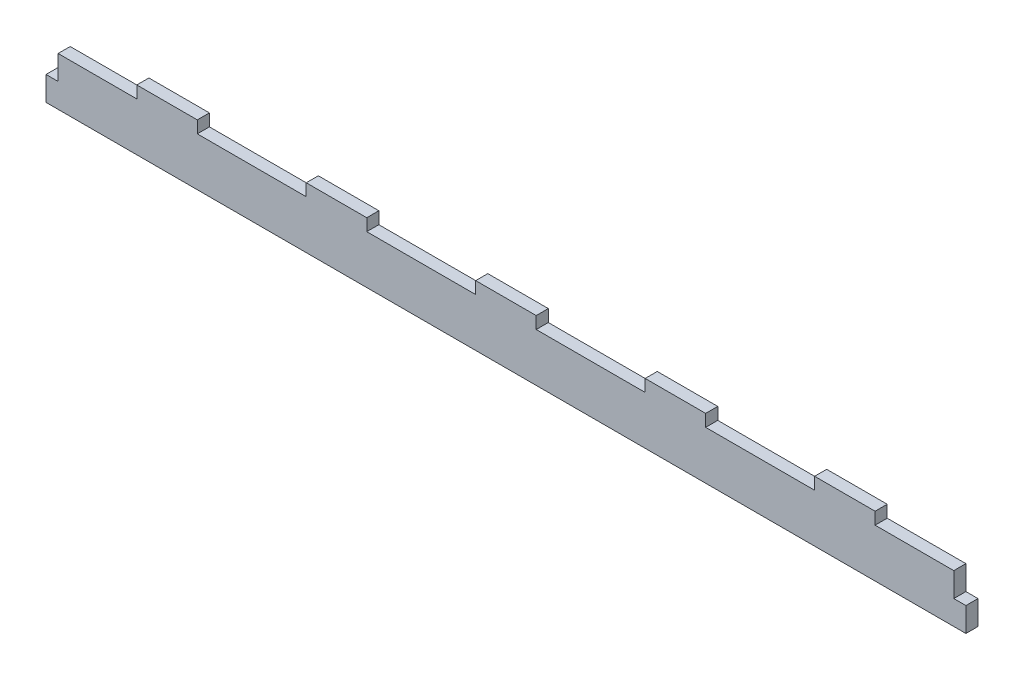
ISO-10303-21;
HEADER;
FILE_DESCRIPTION(('STEP AP214'),'2;1');
FILE_NAME('part.step','',(''),(''),'','','');
FILE_SCHEMA(('AUTOMOTIVE_DESIGN { 1 0 10303 214 1 1 1 1 }'));
ENDSEC;
DATA;
#1=APPLICATION_CONTEXT('core data for automotive mechanical design processes');
#2=APPLICATION_PROTOCOL_DEFINITION('international standard','automotive_design',2000,#1);
#3=PRODUCT_CONTEXT('',#1,'mechanical');
#4=PRODUCT('Part','Part','',(#3));
#5=PRODUCT_RELATED_PRODUCT_CATEGORY('part','',(#4));
#6=PRODUCT_DEFINITION_FORMATION('','',#4);
#7=PRODUCT_DEFINITION_CONTEXT('part definition',#1,'design');
#8=PRODUCT_DEFINITION('design','',#6,#7);
#9=PRODUCT_DEFINITION_SHAPE('','',#8);
#10=(LENGTH_UNIT() NAMED_UNIT(*) SI_UNIT(.MILLI.,.METRE.));
#11=(NAMED_UNIT(*) PLANE_ANGLE_UNIT() SI_UNIT($,.RADIAN.));
#12=(NAMED_UNIT(*) SI_UNIT($,.STERADIAN.) SOLID_ANGLE_UNIT());
#13=UNCERTAINTY_MEASURE_WITH_UNIT(LENGTH_MEASURE(1.E-05),#10,'distance_accuracy_value','');
#14=(GEOMETRIC_REPRESENTATION_CONTEXT(3) GLOBAL_UNCERTAINTY_ASSIGNED_CONTEXT((#13)) GLOBAL_UNIT_ASSIGNED_CONTEXT((#10,
#11,#12)) REPRESENTATION_CONTEXT('',''));
#15=CARTESIAN_POINT('',(0.,0.,0.));
#16=DIRECTION('',(0.,0.,1.));
#17=DIRECTION('',(1.,0.,0.));
#18=AXIS2_PLACEMENT_3D('',#15,#16,#17);
#19=CARTESIAN_POINT('',(72.5000000000003,0.,2.5));
#20=DIRECTION('',(-1.,0.,0.));
#21=DIRECTION('',(0.,0.,1.));
#22=AXIS2_PLACEMENT_3D('',#19,#20,#21);
#23=PLANE('',#22);
#24=DIRECTION('',(0.,1.,0.));
#25=VECTOR('',#24,1.);
#26=CARTESIAN_POINT('',(72.5000000000003,0.,-2.5));
#27=LINE('',#26,#25);
#28=CARTESIAN_POINT('',(72.5000000000003,-24.9999999999885,-2.5));
#29=VERTEX_POINT('',#28);
#30=CARTESIAN_POINT('',(72.5000000000003,-19.9999999999999,-2.5));
#31=VERTEX_POINT('',#30);
#32=EDGE_CURVE('E253',#29,#31,#27,.T.);
#33=ORIENTED_EDGE('',*,*,#32,.F.);
#34=DIRECTION('',(0.,0.,-1.));
#35=VECTOR('',#34,1.);
#36=CARTESIAN_POINT('',(72.5000000000003,-24.9999999999885,2.5));
#37=LINE('',#36,#35);
#38=CARTESIAN_POINT('',(72.5000000000003,-24.9999999999885,2.5));
#39=VERTEX_POINT('',#38);
#40=EDGE_CURVE('E11',#39,#29,#37,.T.);
#41=ORIENTED_EDGE('',*,*,#40,.F.);
#42=DIRECTION('',(0.,1.,0.));
#43=VECTOR('',#42,1.);
#44=CARTESIAN_POINT('',(72.5000000000003,0.,2.5));
#45=LINE('',#44,#43);
#46=CARTESIAN_POINT('',(72.5000000000003,-19.9999999999999,2.5));
#47=VERTEX_POINT('',#46);
#48=EDGE_CURVE('E327',#39,#47,#45,.T.);
#49=ORIENTED_EDGE('',*,*,#48,.T.);
#50=DIRECTION('',(0.,0.,-1.));
#51=VECTOR('',#50,1.);
#52=CARTESIAN_POINT('',(72.5000000000003,-19.9999999999999,2.5));
#53=LINE('',#52,#51);
#54=EDGE_CURVE('E55',#47,#31,#53,.T.);
#55=ORIENTED_EDGE('',*,*,#54,.T.);
#56=EDGE_LOOP('',(#33,#41,#49,#55));
#57=FACE_BOUND('',#56,.T.);
#58=ADVANCED_FACE('F39',(#57),#23,.T.);
#59=CARTESIAN_POINT('',(0.,-24.9999999999885,2.5));
#60=DIRECTION('',(0.,-1.,0.));
#61=DIRECTION('',(0.,0.,-1.));
#62=AXIS2_PLACEMENT_3D('',#59,#60,#61);
#63=PLANE('',#62);
#64=DIRECTION('',(-1.,0.,0.));
#65=VECTOR('',#64,1.);
#66=CARTESIAN_POINT('',(0.,-24.9999999999885,-2.5));
#67=LINE('',#66,#65);
#68=CARTESIAN_POINT('',(40.,-24.9999999999885,-2.5));
#69=VERTEX_POINT('',#68);
#70=EDGE_CURVE('E255',#29,#69,#67,.T.);
#71=ORIENTED_EDGE('',*,*,#70,.T.);
#72=DIRECTION('',(0.,0.,-1.));
#73=VECTOR('',#72,1.);
#74=CARTESIAN_POINT('',(40.,-24.9999999999885,2.5));
#75=LINE('',#74,#73);
#76=CARTESIAN_POINT('',(40.,-24.9999999999885,2.5));
#77=VERTEX_POINT('',#76);
#78=EDGE_CURVE('E47',#77,#69,#75,.T.);
#79=ORIENTED_EDGE('',*,*,#78,.F.);
#80=DIRECTION('',(-1.,0.,0.));
#81=VECTOR('',#80,1.);
#82=CARTESIAN_POINT('',(0.,-24.9999999999885,2.5));
#83=LINE('',#82,#81);
#84=EDGE_CURVE('E404',#39,#77,#83,.T.);
#85=ORIENTED_EDGE('',*,*,#84,.F.);
#86=ORIENTED_EDGE('',*,*,#40,.T.);
#87=EDGE_LOOP('',(#71,#79,#85,#86));
#88=FACE_BOUND('',#87,.T.);
#89=ADVANCED_FACE('F469',(#88),#63,.F.);
#90=CARTESIAN_POINT('',(40.,0.,2.5));
#91=DIRECTION('',(1.,0.,0.));
#92=DIRECTION('',(0.,0.,-1.));
#93=AXIS2_PLACEMENT_3D('',#90,#91,#92);
#94=PLANE('',#93);
#95=DIRECTION('',(0.,-1.,0.));
#96=VECTOR('',#95,1.);
#97=CARTESIAN_POINT('',(40.,0.,-2.5));
#98=LINE('',#97,#96);
#99=CARTESIAN_POINT('',(40.,-34.9999999999885,-2.5));
#100=VERTEX_POINT('',#99);
#101=EDGE_CURVE('E257',#69,#100,#98,.T.);
#102=ORIENTED_EDGE('',*,*,#101,.T.);
#103=DIRECTION('',(0.,0.,-1.));
#104=VECTOR('',#103,1.);
#105=CARTESIAN_POINT('',(40.,-34.9999999999885,2.5));
#106=LINE('',#105,#104);
#107=CARTESIAN_POINT('',(40.,-34.9999999999885,2.5));
#108=VERTEX_POINT('',#107);
#109=EDGE_CURVE('E377',#108,#100,#106,.T.);
#110=ORIENTED_EDGE('',*,*,#109,.F.);
#111=DIRECTION('',(0.,-1.,0.));
#112=VECTOR('',#111,1.);
#113=CARTESIAN_POINT('',(40.,0.,2.5));
#114=LINE('',#113,#112);
#115=EDGE_CURVE('E386',#77,#108,#114,.T.);
#116=ORIENTED_EDGE('',*,*,#115,.F.);
#117=ORIENTED_EDGE('',*,*,#78,.T.);
#118=EDGE_LOOP('',(#102,#110,#116,#117));
#119=FACE_BOUND('',#118,.T.);
#120=ADVANCED_FACE('F384',(#119),#94,.F.);
#121=CARTESIAN_POINT('',(0.,-34.9999999999885,2.5));
#122=DIRECTION('',(0.,-1.,0.));
#123=DIRECTION('',(0.,0.,-1.));
#124=AXIS2_PLACEMENT_3D('',#121,#122,#123);
#125=PLANE('',#124);
#126=DIRECTION('',(-1.,0.,0.));
#127=VECTOR('',#126,1.);
#128=CARTESIAN_POINT('',(0.,-34.9999999999885,-2.5));
#129=LINE('',#128,#127);
#130=CARTESIAN_POINT('',(35.,-34.9999999999885,-2.5));
#131=VERTEX_POINT('',#130);
#132=EDGE_CURVE('E259',#100,#131,#129,.T.);
#133=ORIENTED_EDGE('',*,*,#132,.T.);
#134=DIRECTION('',(0.,0.,-1.));
#135=VECTOR('',#134,1.);
#136=CARTESIAN_POINT('',(35.,-34.9999999999885,2.5));
#137=LINE('',#136,#135);
#138=CARTESIAN_POINT('',(35.,-34.9999999999885,2.5));
#139=VERTEX_POINT('',#138);
#140=EDGE_CURVE('E375',#139,#131,#137,.T.);
#141=ORIENTED_EDGE('',*,*,#140,.F.);
#142=DIRECTION('',(-1.,0.,0.));
#143=VECTOR('',#142,1.);
#144=CARTESIAN_POINT('',(0.,-34.9999999999885,2.5));
#145=LINE('',#144,#143);
#146=EDGE_CURVE('E398',#108,#139,#145,.T.);
#147=ORIENTED_EDGE('',*,*,#146,.F.);
#148=ORIENTED_EDGE('',*,*,#109,.T.);
#149=EDGE_LOOP('',(#133,#141,#147,#148));
#150=FACE_BOUND('',#149,.T.);
#151=ADVANCED_FACE('F395',(#150),#125,.F.);
#152=CARTESIAN_POINT('',(35.,0.,2.5));
#153=DIRECTION('',(-1.,0.,0.));
#154=DIRECTION('',(0.,0.,1.));
#155=AXIS2_PLACEMENT_3D('',#152,#153,#154);
#156=PLANE('',#155);
#157=DIRECTION('',(0.,1.,0.));
#158=VECTOR('',#157,1.);
#159=CARTESIAN_POINT('',(35.,0.,-2.5));
#160=LINE('',#159,#158);
#161=CARTESIAN_POINT('',(35.,-44.9999999999885,-2.5));
#162=VERTEX_POINT('',#161);
#163=EDGE_CURVE('E262',#162,#131,#160,.T.);
#164=ORIENTED_EDGE('',*,*,#163,.F.);
#165=DIRECTION('',(0.,0.,-1.));
#166=VECTOR('',#165,1.);
#167=CARTESIAN_POINT('',(35.,-44.9999999999885,2.5));
#168=LINE('',#167,#166);
#169=CARTESIAN_POINT('',(35.,-44.9999999999885,2.5));
#170=VERTEX_POINT('',#169);
#171=EDGE_CURVE('E373',#170,#162,#168,.T.);
#172=ORIENTED_EDGE('',*,*,#171,.F.);
#173=DIRECTION('',(0.,1.,0.));
#174=VECTOR('',#173,1.);
#175=CARTESIAN_POINT('',(35.,0.,2.5));
#176=LINE('',#175,#174);
#177=EDGE_CURVE('E400',#170,#139,#176,.T.);
#178=ORIENTED_EDGE('',*,*,#177,.T.);
#179=ORIENTED_EDGE('',*,*,#140,.T.);
#180=EDGE_LOOP('',(#164,#172,#178,#179));
#181=FACE_BOUND('',#180,.T.);
#182=ADVANCED_FACE('F480',(#181),#156,.T.);
#183=CARTESIAN_POINT('',(0.,-44.9999999999886,2.5));
#184=DIRECTION('',(0.,-1.,0.));
#185=DIRECTION('',(1.,0.,0.));
#186=AXIS2_PLACEMENT_3D('',#183,#184,#185);
#187=PLANE('',#186);
#188=DIRECTION('',(-1.,0.,0.));
#189=VECTOR('',#188,1.);
#190=CARTESIAN_POINT('',(0.,-44.9999999999886,-2.5));
#191=LINE('',#190,#189);
#192=CARTESIAN_POINT('',(415.000000000001,-44.9999999999885,-2.5));
#193=VERTEX_POINT('',#192);
#194=EDGE_CURVE('E265',#193,#162,#191,.T.);
#195=ORIENTED_EDGE('',*,*,#194,.F.);
#196=DIRECTION('',(0.,0.,-1.));
#197=VECTOR('',#196,1.);
#198=CARTESIAN_POINT('',(415.000000000001,-44.9999999999885,2.5));
#199=LINE('',#198,#197);
#200=CARTESIAN_POINT('',(415.000000000001,-44.9999999999885,2.5));
#201=VERTEX_POINT('',#200);
#202=EDGE_CURVE('E371',#201,#193,#199,.T.);
#203=ORIENTED_EDGE('',*,*,#202,.F.);
#204=DIRECTION('',(-1.,0.,0.));
#205=VECTOR('',#204,1.);
#206=CARTESIAN_POINT('',(0.,-44.9999999999886,2.5));
#207=LINE('',#206,#205);
#208=EDGE_CURVE('E402',#201,#170,#207,.T.);
#209=ORIENTED_EDGE('',*,*,#208,.T.);
#210=ORIENTED_EDGE('',*,*,#171,.T.);
#211=EDGE_LOOP('',(#195,#203,#209,#210));
#212=FACE_BOUND('',#211,.T.);
#213=ADVANCED_FACE('F483',(#212),#187,.T.);
#214=CARTESIAN_POINT('',(415.000000000001,0.,2.5));
#215=DIRECTION('',(-1.,0.,0.));
#216=DIRECTION('',(0.,0.,1.));
#217=AXIS2_PLACEMENT_3D('',#214,#215,#216);
#218=PLANE('',#217);
#219=DIRECTION('',(0.,1.,0.));
#220=VECTOR('',#219,1.);
#221=CARTESIAN_POINT('',(415.000000000001,0.,-2.5));
#222=LINE('',#221,#220);
#223=CARTESIAN_POINT('',(415.000000000001,-34.9999999999885,-2.5));
#224=VERTEX_POINT('',#223);
#225=EDGE_CURVE('E268',#193,#224,#222,.T.);
#226=ORIENTED_EDGE('',*,*,#225,.T.);
#227=DIRECTION('',(0.,0.,-1.));
#228=VECTOR('',#227,1.);
#229=CARTESIAN_POINT('',(415.000000000001,-34.9999999999885,2.5));
#230=LINE('',#229,#228);
#231=CARTESIAN_POINT('',(415.000000000001,-34.9999999999885,2.5));
#232=VERTEX_POINT('',#231);
#233=EDGE_CURVE('E369',#232,#224,#230,.T.);
#234=ORIENTED_EDGE('',*,*,#233,.F.);
#235=DIRECTION('',(0.,1.,0.));
#236=VECTOR('',#235,1.);
#237=CARTESIAN_POINT('',(415.000000000001,0.,2.5));
#238=LINE('',#237,#236);
#239=EDGE_CURVE('E410',#201,#232,#238,.T.);
#240=ORIENTED_EDGE('',*,*,#239,.F.);
#241=ORIENTED_EDGE('',*,*,#202,.T.);
#242=EDGE_LOOP('',(#226,#234,#240,#241));
#243=FACE_BOUND('',#242,.T.);
#244=ADVANCED_FACE('F487',(#243),#218,.F.);
#245=CARTESIAN_POINT('',(0.,-34.9999999999885,2.5));
#246=DIRECTION('',(0.,1.,0.));
#247=DIRECTION('',(0.,0.,1.));
#248=AXIS2_PLACEMENT_3D('',#245,#246,#247);
#249=PLANE('',#248);
#250=DIRECTION('',(1.,0.,0.));
#251=VECTOR('',#250,1.);
#252=CARTESIAN_POINT('',(0.,-34.9999999999885,-2.5));
#253=LINE('',#252,#251);
#254=CARTESIAN_POINT('',(410.000000000001,-34.9999999999885,-2.5));
#255=VERTEX_POINT('',#254);
#256=EDGE_CURVE('E271',#255,#224,#253,.T.);
#257=ORIENTED_EDGE('',*,*,#256,.F.);
#258=DIRECTION('',(0.,0.,-1.));
#259=VECTOR('',#258,1.);
#260=CARTESIAN_POINT('',(410.000000000001,-34.9999999999885,2.5));
#261=LINE('',#260,#259);
#262=CARTESIAN_POINT('',(410.000000000001,-34.9999999999885,2.5));
#263=VERTEX_POINT('',#262);
#264=EDGE_CURVE('E367',#263,#255,#261,.T.);
#265=ORIENTED_EDGE('',*,*,#264,.F.);
#266=DIRECTION('',(1.,0.,0.));
#267=VECTOR('',#266,1.);
#268=CARTESIAN_POINT('',(0.,-34.9999999999885,2.5));
#269=LINE('',#268,#267);
#270=EDGE_CURVE('E412',#263,#232,#269,.T.);
#271=ORIENTED_EDGE('',*,*,#270,.T.);
#272=ORIENTED_EDGE('',*,*,#233,.T.);
#273=EDGE_LOOP('',(#257,#265,#271,#272));
#274=FACE_BOUND('',#273,.T.);
#275=ADVANCED_FACE('F491',(#274),#249,.T.);
#276=CARTESIAN_POINT('',(410.000000000001,0.,2.5));
#277=DIRECTION('',(1.,0.,0.));
#278=DIRECTION('',(0.,0.,-1.));
#279=AXIS2_PLACEMENT_3D('',#276,#277,#278);
#280=PLANE('',#279);
#281=DIRECTION('',(0.,-1.,0.));
#282=VECTOR('',#281,1.);
#283=CARTESIAN_POINT('',(410.000000000001,0.,-2.5));
#284=LINE('',#283,#282);
#285=CARTESIAN_POINT('',(410.000000000001,-24.9999999999885,-2.5));
#286=VERTEX_POINT('',#285);
#287=EDGE_CURVE('E274',#286,#255,#284,.T.);
#288=ORIENTED_EDGE('',*,*,#287,.F.);
#289=DIRECTION('',(0.,0.,-1.));
#290=VECTOR('',#289,1.);
#291=CARTESIAN_POINT('',(410.000000000001,-24.9999999999885,2.5));
#292=LINE('',#291,#290);
#293=CARTESIAN_POINT('',(410.000000000001,-24.9999999999885,2.5));
#294=VERTEX_POINT('',#293);
#295=EDGE_CURVE('E365',#294,#286,#292,.T.);
#296=ORIENTED_EDGE('',*,*,#295,.F.);
#297=DIRECTION('',(0.,-1.,0.));
#298=VECTOR('',#297,1.);
#299=CARTESIAN_POINT('',(410.000000000001,0.,2.5));
#300=LINE('',#299,#298);
#301=EDGE_CURVE('E415',#294,#263,#300,.T.);
#302=ORIENTED_EDGE('',*,*,#301,.T.);
#303=ORIENTED_EDGE('',*,*,#264,.T.);
#304=EDGE_LOOP('',(#288,#296,#302,#303));
#305=FACE_BOUND('',#304,.T.);
#306=ADVANCED_FACE('F495',(#305),#280,.T.);
#307=CARTESIAN_POINT('',(0.,-24.9999999999885,2.5));
#308=DIRECTION('',(0.,-1.,0.));
#309=DIRECTION('',(0.,0.,-1.));
#310=AXIS2_PLACEMENT_3D('',#307,#308,#309);
#311=PLANE('',#310);
#312=DIRECTION('',(-1.,0.,0.));
#313=VECTOR('',#312,1.);
#314=CARTESIAN_POINT('',(0.,-24.9999999999885,-2.5));
#315=LINE('',#314,#313);
#316=CARTESIAN_POINT('',(377.5,-24.9999999999885,-2.5));
#317=VERTEX_POINT('',#316);
#318=EDGE_CURVE('E277',#286,#317,#315,.T.);
#319=ORIENTED_EDGE('',*,*,#318,.T.);
#320=DIRECTION('',(0.,0.,-1.));
#321=VECTOR('',#320,1.);
#322=CARTESIAN_POINT('',(377.5,-24.9999999999885,2.5));
#323=LINE('',#322,#321);
#324=CARTESIAN_POINT('',(377.5,-24.9999999999885,2.5));
#325=VERTEX_POINT('',#324);
#326=EDGE_CURVE('E362',#325,#317,#323,.T.);
#327=ORIENTED_EDGE('',*,*,#326,.F.);
#328=DIRECTION('',(-1.,0.,0.));
#329=VECTOR('',#328,1.);
#330=CARTESIAN_POINT('',(0.,-24.9999999999885,2.5));
#331=LINE('',#330,#329);
#332=EDGE_CURVE('E418',#294,#325,#331,.T.);
#333=ORIENTED_EDGE('',*,*,#332,.F.);
#334=ORIENTED_EDGE('',*,*,#295,.T.);
#335=EDGE_LOOP('',(#319,#327,#333,#334));
#336=FACE_BOUND('',#335,.T.);
#337=ADVANCED_FACE('F499',(#336),#311,.F.);
#338=CARTESIAN_POINT('',(377.5,0.,2.5));
#339=DIRECTION('',(-1.,0.,0.));
#340=DIRECTION('',(0.,0.,1.));
#341=AXIS2_PLACEMENT_3D('',#338,#339,#340);
#342=PLANE('',#341);
#343=DIRECTION('',(0.,1.,0.));
#344=VECTOR('',#343,1.);
#345=CARTESIAN_POINT('',(377.5,0.,-2.5));
#346=LINE('',#345,#344);
#347=CARTESIAN_POINT('',(377.5,-19.9999999999999,-2.5));
#348=VERTEX_POINT('',#347);
#349=EDGE_CURVE('E279',#317,#348,#346,.T.);
#350=ORIENTED_EDGE('',*,*,#349,.T.);
#351=DIRECTION('',(0.,0.,-1.));
#352=VECTOR('',#351,1.);
#353=CARTESIAN_POINT('',(377.5,-19.9999999999999,2.5));
#354=LINE('',#353,#352);
#355=CARTESIAN_POINT('',(377.5,-19.9999999999999,2.5));
#356=VERTEX_POINT('',#355);
#357=EDGE_CURVE('E360',#356,#348,#354,.T.);
#358=ORIENTED_EDGE('',*,*,#357,.F.);
#359=DIRECTION('',(0.,1.,0.));
#360=VECTOR('',#359,1.);
#361=CARTESIAN_POINT('',(377.5,0.,2.5));
#362=LINE('',#361,#360);
#363=EDGE_CURVE('E420',#325,#356,#362,.T.);
#364=ORIENTED_EDGE('',*,*,#363,.F.);
#365=ORIENTED_EDGE('',*,*,#326,.T.);
#366=EDGE_LOOP('',(#350,#358,#364,#365));
#367=FACE_BOUND('',#366,.T.);
#368=ADVANCED_FACE('F503',(#367),#342,.F.);
#369=CARTESIAN_POINT('',(0.,-19.9999999999999,2.5));
#370=DIRECTION('',(0.,1.,0.));
#371=DIRECTION('',(0.,0.,1.));
#372=AXIS2_PLACEMENT_3D('',#369,#370,#371);
#373=PLANE('',#372);
#374=DIRECTION('',(1.,0.,0.));
#375=VECTOR('',#374,1.);
#376=CARTESIAN_POINT('',(0.,-19.9999999999999,-2.5));
#377=LINE('',#376,#375);
#378=CARTESIAN_POINT('',(352.5,-19.9999999999999,-2.5));
#379=VERTEX_POINT('',#378);
#380=EDGE_CURVE('E282',#379,#348,#377,.T.);
#381=ORIENTED_EDGE('',*,*,#380,.F.);
#382=DIRECTION('',(0.,0.,-1.));
#383=VECTOR('',#382,1.);
#384=CARTESIAN_POINT('',(352.5,-19.9999999999999,2.5));
#385=LINE('',#384,#383);
#386=CARTESIAN_POINT('',(352.5,-19.9999999999999,2.5));
#387=VERTEX_POINT('',#386);
#388=EDGE_CURVE('E358',#387,#379,#385,.T.);
#389=ORIENTED_EDGE('',*,*,#388,.F.);
#390=DIRECTION('',(1.,0.,0.));
#391=VECTOR('',#390,1.);
#392=CARTESIAN_POINT('',(0.,-19.9999999999999,2.5));
#393=LINE('',#392,#391);
#394=EDGE_CURVE('E422',#387,#356,#393,.T.);
#395=ORIENTED_EDGE('',*,*,#394,.T.);
#396=ORIENTED_EDGE('',*,*,#357,.T.);
#397=EDGE_LOOP('',(#381,#389,#395,#396));
#398=FACE_BOUND('',#397,.T.);
#399=ADVANCED_FACE('F507',(#398),#373,.T.);
#400=CARTESIAN_POINT('',(352.5,0.,2.5));
#401=DIRECTION('',(-1.,0.,0.));
#402=DIRECTION('',(0.,0.,1.));
#403=AXIS2_PLACEMENT_3D('',#400,#401,#402);
#404=PLANE('',#403);
#405=DIRECTION('',(0.,1.,0.));
#406=VECTOR('',#405,1.);
#407=CARTESIAN_POINT('',(352.5,0.,-2.5));
#408=LINE('',#407,#406);
#409=CARTESIAN_POINT('',(352.5,-24.9999999999885,-2.5));
#410=VERTEX_POINT('',#409);
#411=EDGE_CURVE('E285',#410,#379,#408,.T.);
#412=ORIENTED_EDGE('',*,*,#411,.F.);
#413=DIRECTION('',(0.,0.,-1.));
#414=VECTOR('',#413,1.);
#415=CARTESIAN_POINT('',(352.5,-24.9999999999885,2.5));
#416=LINE('',#415,#414);
#417=CARTESIAN_POINT('',(352.5,-24.9999999999885,2.5));
#418=VERTEX_POINT('',#417);
#419=EDGE_CURVE('E356',#418,#410,#416,.T.);
#420=ORIENTED_EDGE('',*,*,#419,.F.);
#421=DIRECTION('',(0.,1.,0.));
#422=VECTOR('',#421,1.);
#423=CARTESIAN_POINT('',(352.5,0.,2.5));
#424=LINE('',#423,#422);
#425=EDGE_CURVE('E425',#418,#387,#424,.T.);
#426=ORIENTED_EDGE('',*,*,#425,.T.);
#427=ORIENTED_EDGE('',*,*,#388,.T.);
#428=EDGE_LOOP('',(#412,#420,#426,#427));
#429=FACE_BOUND('',#428,.T.);
#430=ADVANCED_FACE('F511',(#429),#404,.T.);
#431=CARTESIAN_POINT('',(0.,-24.9999999999885,2.5));
#432=DIRECTION('',(0.,-1.,0.));
#433=DIRECTION('',(0.,0.,-1.));
#434=AXIS2_PLACEMENT_3D('',#431,#432,#433);
#435=PLANE('',#434);
#436=DIRECTION('',(-1.,0.,0.));
#437=VECTOR('',#436,1.);
#438=CARTESIAN_POINT('',(0.,-24.9999999999885,-2.5));
#439=LINE('',#438,#437);
#440=CARTESIAN_POINT('',(307.5,-24.9999999999885,-2.5));
#441=VERTEX_POINT('',#440);
#442=EDGE_CURVE('E288',#410,#441,#439,.T.);
#443=ORIENTED_EDGE('',*,*,#442,.T.);
#444=DIRECTION('',(0.,0.,-1.));
#445=VECTOR('',#444,1.);
#446=CARTESIAN_POINT('',(307.5,-24.9999999999885,2.5));
#447=LINE('',#446,#445);
#448=CARTESIAN_POINT('',(307.5,-24.9999999999885,2.5));
#449=VERTEX_POINT('',#448);
#450=EDGE_CURVE('E353',#449,#441,#447,.T.);
#451=ORIENTED_EDGE('',*,*,#450,.F.);
#452=DIRECTION('',(-1.,0.,0.));
#453=VECTOR('',#452,1.);
#454=CARTESIAN_POINT('',(0.,-24.9999999999885,2.5));
#455=LINE('',#454,#453);
#456=EDGE_CURVE('E428',#418,#449,#455,.T.);
#457=ORIENTED_EDGE('',*,*,#456,.F.);
#458=ORIENTED_EDGE('',*,*,#419,.T.);
#459=EDGE_LOOP('',(#443,#451,#457,#458));
#460=FACE_BOUND('',#459,.T.);
#461=ADVANCED_FACE('F515',(#460),#435,.F.);
#462=CARTESIAN_POINT('',(307.5,0.,2.5));
#463=DIRECTION('',(-1.,0.,0.));
#464=DIRECTION('',(0.,0.,1.));
#465=AXIS2_PLACEMENT_3D('',#462,#463,#464);
#466=PLANE('',#465);
#467=DIRECTION('',(0.,1.,0.));
#468=VECTOR('',#467,1.);
#469=CARTESIAN_POINT('',(307.5,0.,-2.5));
#470=LINE('',#469,#468);
#471=CARTESIAN_POINT('',(307.5,-19.9999999999999,-2.5));
#472=VERTEX_POINT('',#471);
#473=EDGE_CURVE('E290',#441,#472,#470,.T.);
#474=ORIENTED_EDGE('',*,*,#473,.T.);
#475=DIRECTION('',(0.,0.,-1.));
#476=VECTOR('',#475,1.);
#477=CARTESIAN_POINT('',(307.5,-19.9999999999999,2.5));
#478=LINE('',#477,#476);
#479=CARTESIAN_POINT('',(307.5,-19.9999999999999,2.5));
#480=VERTEX_POINT('',#479);
#481=EDGE_CURVE('E351',#480,#472,#478,.T.);
#482=ORIENTED_EDGE('',*,*,#481,.F.);
#483=DIRECTION('',(0.,1.,0.));
#484=VECTOR('',#483,1.);
#485=CARTESIAN_POINT('',(307.5,0.,2.5));
#486=LINE('',#485,#484);
#487=EDGE_CURVE('E430',#449,#480,#486,.T.);
#488=ORIENTED_EDGE('',*,*,#487,.F.);
#489=ORIENTED_EDGE('',*,*,#450,.T.);
#490=EDGE_LOOP('',(#474,#482,#488,#489));
#491=FACE_BOUND('',#490,.T.);
#492=ADVANCED_FACE('F519',(#491),#466,.F.);
#493=CARTESIAN_POINT('',(0.,-19.9999999999999,2.5));
#494=DIRECTION('',(0.,1.,0.));
#495=DIRECTION('',(0.,0.,1.));
#496=AXIS2_PLACEMENT_3D('',#493,#494,#495);
#497=PLANE('',#496);
#498=DIRECTION('',(1.,0.,0.));
#499=VECTOR('',#498,1.);
#500=CARTESIAN_POINT('',(0.,-19.9999999999999,-2.5));
#501=LINE('',#500,#499);
#502=CARTESIAN_POINT('',(282.5,-19.9999999999999,-2.5));
#503=VERTEX_POINT('',#502);
#504=EDGE_CURVE('E293',#503,#472,#501,.T.);
#505=ORIENTED_EDGE('',*,*,#504,.F.);
#506=DIRECTION('',(0.,0.,-1.));
#507=VECTOR('',#506,1.);
#508=CARTESIAN_POINT('',(282.5,-19.9999999999999,2.5));
#509=LINE('',#508,#507);
#510=CARTESIAN_POINT('',(282.5,-19.9999999999999,2.5));
#511=VERTEX_POINT('',#510);
#512=EDGE_CURVE('E349',#511,#503,#509,.T.);
#513=ORIENTED_EDGE('',*,*,#512,.F.);
#514=DIRECTION('',(1.,0.,0.));
#515=VECTOR('',#514,1.);
#516=CARTESIAN_POINT('',(0.,-19.9999999999999,2.5));
#517=LINE('',#516,#515);
#518=EDGE_CURVE('E432',#511,#480,#517,.T.);
#519=ORIENTED_EDGE('',*,*,#518,.T.);
#520=ORIENTED_EDGE('',*,*,#481,.T.);
#521=EDGE_LOOP('',(#505,#513,#519,#520));
#522=FACE_BOUND('',#521,.T.);
#523=ADVANCED_FACE('F523',(#522),#497,.T.);
#524=CARTESIAN_POINT('',(282.5,0.,2.5));
#525=DIRECTION('',(-1.,0.,0.));
#526=DIRECTION('',(0.,0.,1.));
#527=AXIS2_PLACEMENT_3D('',#524,#525,#526);
#528=PLANE('',#527);
#529=DIRECTION('',(0.,1.,0.));
#530=VECTOR('',#529,1.);
#531=CARTESIAN_POINT('',(282.5,0.,-2.5));
#532=LINE('',#531,#530);
#533=CARTESIAN_POINT('',(282.5,-24.9999999999885,-2.5));
#534=VERTEX_POINT('',#533);
#535=EDGE_CURVE('E296',#534,#503,#532,.T.);
#536=ORIENTED_EDGE('',*,*,#535,.F.);
#537=DIRECTION('',(0.,0.,-1.));
#538=VECTOR('',#537,1.);
#539=CARTESIAN_POINT('',(282.5,-24.9999999999885,2.5));
#540=LINE('',#539,#538);
#541=CARTESIAN_POINT('',(282.5,-24.9999999999885,2.5));
#542=VERTEX_POINT('',#541);
#543=EDGE_CURVE('E347',#542,#534,#540,.T.);
#544=ORIENTED_EDGE('',*,*,#543,.F.);
#545=DIRECTION('',(0.,1.,0.));
#546=VECTOR('',#545,1.);
#547=CARTESIAN_POINT('',(282.5,0.,2.5));
#548=LINE('',#547,#546);
#549=EDGE_CURVE('E435',#542,#511,#548,.T.);
#550=ORIENTED_EDGE('',*,*,#549,.T.);
#551=ORIENTED_EDGE('',*,*,#512,.T.);
#552=EDGE_LOOP('',(#536,#544,#550,#551));
#553=FACE_BOUND('',#552,.T.);
#554=ADVANCED_FACE('F527',(#553),#528,.T.);
#555=CARTESIAN_POINT('',(0.,-24.9999999999885,2.5));
#556=DIRECTION('',(0.,-1.,0.));
#557=DIRECTION('',(0.,0.,-1.));
#558=AXIS2_PLACEMENT_3D('',#555,#556,#557);
#559=PLANE('',#558);
#560=DIRECTION('',(-1.,0.,0.));
#561=VECTOR('',#560,1.);
#562=CARTESIAN_POINT('',(0.,-24.9999999999885,-2.5));
#563=LINE('',#562,#561);
#564=CARTESIAN_POINT('',(237.5,-24.9999999999885,-2.5));
#565=VERTEX_POINT('',#564);
#566=EDGE_CURVE('E299',#534,#565,#563,.T.);
#567=ORIENTED_EDGE('',*,*,#566,.T.);
#568=DIRECTION('',(0.,0.,-1.));
#569=VECTOR('',#568,1.);
#570=CARTESIAN_POINT('',(237.5,-24.9999999999885,2.5));
#571=LINE('',#570,#569);
#572=CARTESIAN_POINT('',(237.5,-24.9999999999885,2.5));
#573=VERTEX_POINT('',#572);
#574=EDGE_CURVE('E344',#573,#565,#571,.T.);
#575=ORIENTED_EDGE('',*,*,#574,.F.);
#576=DIRECTION('',(-1.,0.,0.));
#577=VECTOR('',#576,1.);
#578=CARTESIAN_POINT('',(0.,-24.9999999999885,2.5));
#579=LINE('',#578,#577);
#580=EDGE_CURVE('E438',#542,#573,#579,.T.);
#581=ORIENTED_EDGE('',*,*,#580,.F.);
#582=ORIENTED_EDGE('',*,*,#543,.T.);
#583=EDGE_LOOP('',(#567,#575,#581,#582));
#584=FACE_BOUND('',#583,.T.);
#585=ADVANCED_FACE('F531',(#584),#559,.F.);
#586=CARTESIAN_POINT('',(237.5,0.,2.5));
#587=DIRECTION('',(-1.,0.,0.));
#588=DIRECTION('',(0.,0.,1.));
#589=AXIS2_PLACEMENT_3D('',#586,#587,#588);
#590=PLANE('',#589);
#591=DIRECTION('',(0.,1.,0.));
#592=VECTOR('',#591,1.);
#593=CARTESIAN_POINT('',(237.5,0.,-2.5));
#594=LINE('',#593,#592);
#595=CARTESIAN_POINT('',(237.5,-19.9999999999999,-2.5));
#596=VERTEX_POINT('',#595);
#597=EDGE_CURVE('E301',#565,#596,#594,.T.);
#598=ORIENTED_EDGE('',*,*,#597,.T.);
#599=DIRECTION('',(0.,0.,-1.));
#600=VECTOR('',#599,1.);
#601=CARTESIAN_POINT('',(237.5,-19.9999999999999,2.5));
#602=LINE('',#601,#600);
#603=CARTESIAN_POINT('',(237.5,-19.9999999999999,2.5));
#604=VERTEX_POINT('',#603);
#605=EDGE_CURVE('E342',#604,#596,#602,.T.);
#606=ORIENTED_EDGE('',*,*,#605,.F.);
#607=DIRECTION('',(0.,1.,0.));
#608=VECTOR('',#607,1.);
#609=CARTESIAN_POINT('',(237.5,0.,2.5));
#610=LINE('',#609,#608);
#611=EDGE_CURVE('E440',#573,#604,#610,.T.);
#612=ORIENTED_EDGE('',*,*,#611,.F.);
#613=ORIENTED_EDGE('',*,*,#574,.T.);
#614=EDGE_LOOP('',(#598,#606,#612,#613));
#615=FACE_BOUND('',#614,.T.);
#616=ADVANCED_FACE('F535',(#615),#590,.F.);
#617=CARTESIAN_POINT('',(0.,-19.9999999999999,2.5));
#618=DIRECTION('',(0.,1.,0.));
#619=DIRECTION('',(0.,0.,1.));
#620=AXIS2_PLACEMENT_3D('',#617,#618,#619);
#621=PLANE('',#620);
#622=DIRECTION('',(1.,0.,0.));
#623=VECTOR('',#622,1.);
#624=CARTESIAN_POINT('',(0.,-19.9999999999999,-2.5));
#625=LINE('',#624,#623);
#626=CARTESIAN_POINT('',(212.5,-19.9999999999999,-2.5));
#627=VERTEX_POINT('',#626);
#628=EDGE_CURVE('E304',#627,#596,#625,.T.);
#629=ORIENTED_EDGE('',*,*,#628,.F.);
#630=DIRECTION('',(0.,0.,-1.));
#631=VECTOR('',#630,1.);
#632=CARTESIAN_POINT('',(212.5,-19.9999999999999,2.5));
#633=LINE('',#632,#631);
#634=CARTESIAN_POINT('',(212.5,-19.9999999999999,2.5));
#635=VERTEX_POINT('',#634);
#636=EDGE_CURVE('E340',#635,#627,#633,.T.);
#637=ORIENTED_EDGE('',*,*,#636,.F.);
#638=DIRECTION('',(1.,0.,0.));
#639=VECTOR('',#638,1.);
#640=CARTESIAN_POINT('',(0.,-19.9999999999999,2.5));
#641=LINE('',#640,#639);
#642=EDGE_CURVE('E442',#635,#604,#641,.T.);
#643=ORIENTED_EDGE('',*,*,#642,.T.);
#644=ORIENTED_EDGE('',*,*,#605,.T.);
#645=EDGE_LOOP('',(#629,#637,#643,#644));
#646=FACE_BOUND('',#645,.T.);
#647=ADVANCED_FACE('F539',(#646),#621,.T.);
#648=CARTESIAN_POINT('',(212.5,0.,2.5));
#649=DIRECTION('',(-1.,0.,0.));
#650=DIRECTION('',(0.,0.,1.));
#651=AXIS2_PLACEMENT_3D('',#648,#649,#650);
#652=PLANE('',#651);
#653=DIRECTION('',(0.,1.,0.));
#654=VECTOR('',#653,1.);
#655=CARTESIAN_POINT('',(212.5,0.,-2.5));
#656=LINE('',#655,#654);
#657=CARTESIAN_POINT('',(212.5,-24.9999999999885,-2.5));
#658=VERTEX_POINT('',#657);
#659=EDGE_CURVE('E307',#658,#627,#656,.T.);
#660=ORIENTED_EDGE('',*,*,#659,.F.);
#661=DIRECTION('',(0.,0.,-1.));
#662=VECTOR('',#661,1.);
#663=CARTESIAN_POINT('',(212.5,-24.9999999999885,2.5));
#664=LINE('',#663,#662);
#665=CARTESIAN_POINT('',(212.5,-24.9999999999885,2.5));
#666=VERTEX_POINT('',#665);
#667=EDGE_CURVE('E338',#666,#658,#664,.T.);
#668=ORIENTED_EDGE('',*,*,#667,.F.);
#669=DIRECTION('',(0.,1.,0.));
#670=VECTOR('',#669,1.);
#671=CARTESIAN_POINT('',(212.5,0.,2.5));
#672=LINE('',#671,#670);
#673=EDGE_CURVE('E445',#666,#635,#672,.T.);
#674=ORIENTED_EDGE('',*,*,#673,.T.);
#675=ORIENTED_EDGE('',*,*,#636,.T.);
#676=EDGE_LOOP('',(#660,#668,#674,#675));
#677=FACE_BOUND('',#676,.T.);
#678=ADVANCED_FACE('F543',(#677),#652,.T.);
#679=CARTESIAN_POINT('',(0.,-24.9999999999885,2.5));
#680=DIRECTION('',(0.,-1.,0.));
#681=DIRECTION('',(0.,0.,-1.));
#682=AXIS2_PLACEMENT_3D('',#679,#680,#681);
#683=PLANE('',#682);
#684=DIRECTION('',(-1.,0.,0.));
#685=VECTOR('',#684,1.);
#686=CARTESIAN_POINT('',(0.,-24.9999999999885,-2.5));
#687=LINE('',#686,#685);
#688=CARTESIAN_POINT('',(167.5,-24.9999999999885,-2.5));
#689=VERTEX_POINT('',#688);
#690=EDGE_CURVE('E310',#658,#689,#687,.T.);
#691=ORIENTED_EDGE('',*,*,#690,.T.);
#692=DIRECTION('',(0.,0.,-1.));
#693=VECTOR('',#692,1.);
#694=CARTESIAN_POINT('',(167.5,-24.9999999999885,2.5));
#695=LINE('',#694,#693);
#696=CARTESIAN_POINT('',(167.5,-24.9999999999885,2.5));
#697=VERTEX_POINT('',#696);
#698=EDGE_CURVE('E335',#697,#689,#695,.T.);
#699=ORIENTED_EDGE('',*,*,#698,.F.);
#700=DIRECTION('',(-1.,0.,0.));
#701=VECTOR('',#700,1.);
#702=CARTESIAN_POINT('',(0.,-24.9999999999885,2.5));
#703=LINE('',#702,#701);
#704=EDGE_CURVE('E448',#666,#697,#703,.T.);
#705=ORIENTED_EDGE('',*,*,#704,.F.);
#706=ORIENTED_EDGE('',*,*,#667,.T.);
#707=EDGE_LOOP('',(#691,#699,#705,#706));
#708=FACE_BOUND('',#707,.T.);
#709=ADVANCED_FACE('F547',(#708),#683,.F.);
#710=CARTESIAN_POINT('',(167.5,0.,2.5));
#711=DIRECTION('',(-1.,0.,0.));
#712=DIRECTION('',(0.,0.,1.));
#713=AXIS2_PLACEMENT_3D('',#710,#711,#712);
#714=PLANE('',#713);
#715=DIRECTION('',(0.,1.,0.));
#716=VECTOR('',#715,1.);
#717=CARTESIAN_POINT('',(167.5,0.,-2.5));
#718=LINE('',#717,#716);
#719=CARTESIAN_POINT('',(167.5,-19.9999999999999,-2.5));
#720=VERTEX_POINT('',#719);
#721=EDGE_CURVE('E312',#689,#720,#718,.T.);
#722=ORIENTED_EDGE('',*,*,#721,.T.);
#723=DIRECTION('',(0.,0.,-1.));
#724=VECTOR('',#723,1.);
#725=CARTESIAN_POINT('',(167.5,-19.9999999999999,2.5));
#726=LINE('',#725,#724);
#727=CARTESIAN_POINT('',(167.5,-19.9999999999999,2.5));
#728=VERTEX_POINT('',#727);
#729=EDGE_CURVE('E333',#728,#720,#726,.T.);
#730=ORIENTED_EDGE('',*,*,#729,.F.);
#731=DIRECTION('',(0.,1.,0.));
#732=VECTOR('',#731,1.);
#733=CARTESIAN_POINT('',(167.5,0.,2.5));
#734=LINE('',#733,#732);
#735=EDGE_CURVE('E450',#697,#728,#734,.T.);
#736=ORIENTED_EDGE('',*,*,#735,.F.);
#737=ORIENTED_EDGE('',*,*,#698,.T.);
#738=EDGE_LOOP('',(#722,#730,#736,#737));
#739=FACE_BOUND('',#738,.T.);
#740=ADVANCED_FACE('F551',(#739),#714,.F.);
#741=CARTESIAN_POINT('',(0.,-19.9999999999999,2.5));
#742=DIRECTION('',(0.,1.,0.));
#743=DIRECTION('',(0.,0.,1.));
#744=AXIS2_PLACEMENT_3D('',#741,#742,#743);
#745=PLANE('',#744);
#746=DIRECTION('',(1.,0.,0.));
#747=VECTOR('',#746,1.);
#748=CARTESIAN_POINT('',(0.,-19.9999999999999,-2.5));
#749=LINE('',#748,#747);
#750=CARTESIAN_POINT('',(142.5,-19.9999999999999,-2.5));
#751=VERTEX_POINT('',#750);
#752=EDGE_CURVE('E315',#751,#720,#749,.T.);
#753=ORIENTED_EDGE('',*,*,#752,.F.);
#754=DIRECTION('',(0.,0.,-1.));
#755=VECTOR('',#754,1.);
#756=CARTESIAN_POINT('',(142.5,-19.9999999999999,2.5));
#757=LINE('',#756,#755);
#758=CARTESIAN_POINT('',(142.5,-19.9999999999999,2.5));
#759=VERTEX_POINT('',#758);
#760=EDGE_CURVE('E331',#759,#751,#757,.T.);
#761=ORIENTED_EDGE('',*,*,#760,.F.);
#762=DIRECTION('',(1.,0.,0.));
#763=VECTOR('',#762,1.);
#764=CARTESIAN_POINT('',(0.,-19.9999999999999,2.5));
#765=LINE('',#764,#763);
#766=EDGE_CURVE('E452',#759,#728,#765,.T.);
#767=ORIENTED_EDGE('',*,*,#766,.T.);
#768=ORIENTED_EDGE('',*,*,#729,.T.);
#769=EDGE_LOOP('',(#753,#761,#767,#768));
#770=FACE_BOUND('',#769,.T.);
#771=ADVANCED_FACE('F555',(#770),#745,.T.);
#772=CARTESIAN_POINT('',(142.5,0.,2.5));
#773=DIRECTION('',(-1.,0.,0.));
#774=DIRECTION('',(0.,0.,1.));
#775=AXIS2_PLACEMENT_3D('',#772,#773,#774);
#776=PLANE('',#775);
#777=DIRECTION('',(0.,1.,0.));
#778=VECTOR('',#777,1.);
#779=CARTESIAN_POINT('',(142.5,0.,-2.5));
#780=LINE('',#779,#778);
#781=CARTESIAN_POINT('',(142.5,-24.9999999999885,-2.5));
#782=VERTEX_POINT('',#781);
#783=EDGE_CURVE('E318',#782,#751,#780,.T.);
#784=ORIENTED_EDGE('',*,*,#783,.F.);
#785=DIRECTION('',(0.,0.,-1.));
#786=VECTOR('',#785,1.);
#787=CARTESIAN_POINT('',(142.5,-24.9999999999885,2.5));
#788=LINE('',#787,#786);
#789=CARTESIAN_POINT('',(142.5,-24.9999999999885,2.5));
#790=VERTEX_POINT('',#789);
#791=EDGE_CURVE('E245',#790,#782,#788,.T.);
#792=ORIENTED_EDGE('',*,*,#791,.F.);
#793=DIRECTION('',(0.,1.,0.));
#794=VECTOR('',#793,1.);
#795=CARTESIAN_POINT('',(142.5,0.,2.5));
#796=LINE('',#795,#794);
#797=EDGE_CURVE('E235',#790,#759,#796,.T.);
#798=ORIENTED_EDGE('',*,*,#797,.T.);
#799=ORIENTED_EDGE('',*,*,#760,.T.);
#800=EDGE_LOOP('',(#784,#792,#798,#799));
#801=FACE_BOUND('',#800,.T.);
#802=ADVANCED_FACE('F456',(#801),#776,.T.);
#803=CARTESIAN_POINT('',(0.,-24.9999999999885,2.5));
#804=DIRECTION('',(0.,-1.,0.));
#805=DIRECTION('',(0.,0.,-1.));
#806=AXIS2_PLACEMENT_3D('',#803,#804,#805);
#807=PLANE('',#806);
#808=DIRECTION('',(-1.,0.,0.));
#809=VECTOR('',#808,1.);
#810=CARTESIAN_POINT('',(0.,-24.9999999999885,-2.5));
#811=LINE('',#810,#809);
#812=CARTESIAN_POINT('',(97.5000000000003,-24.9999999999885,-2.5));
#813=VERTEX_POINT('',#812);
#814=EDGE_CURVE('E242',#782,#813,#811,.T.);
#815=ORIENTED_EDGE('',*,*,#814,.T.);
#816=DIRECTION('',(0.,0.,-1.));
#817=VECTOR('',#816,1.);
#818=CARTESIAN_POINT('',(97.5000000000003,-24.9999999999885,2.5));
#819=LINE('',#818,#817);
#820=CARTESIAN_POINT('',(97.5000000000003,-24.9999999999885,2.5));
#821=VERTEX_POINT('',#820);
#822=EDGE_CURVE('E239',#821,#813,#819,.T.);
#823=ORIENTED_EDGE('',*,*,#822,.F.);
#824=DIRECTION('',(-1.,0.,0.));
#825=VECTOR('',#824,1.);
#826=CARTESIAN_POINT('',(0.,-24.9999999999885,2.5));
#827=LINE('',#826,#825);
#828=EDGE_CURVE('E226',#790,#821,#827,.T.);
#829=ORIENTED_EDGE('',*,*,#828,.F.);
#830=ORIENTED_EDGE('',*,*,#791,.T.);
#831=EDGE_LOOP('',(#815,#823,#829,#830));
#832=FACE_BOUND('',#831,.T.);
#833=ADVANCED_FACE('F240',(#832),#807,.F.);
#834=CARTESIAN_POINT('',(97.5000000000003,0.,2.5));
#835=DIRECTION('',(-1.,0.,0.));
#836=DIRECTION('',(0.,0.,1.));
#837=AXIS2_PLACEMENT_3D('',#834,#835,#836);
#838=PLANE('',#837);
#839=DIRECTION('',(0.,1.,0.));
#840=VECTOR('',#839,1.);
#841=CARTESIAN_POINT('',(97.5000000000003,0.,-2.5));
#842=LINE('',#841,#840);
#843=CARTESIAN_POINT('',(97.5000000000003,-19.9999999999999,-2.5));
#844=VERTEX_POINT('',#843);
#845=EDGE_CURVE('E322',#813,#844,#842,.T.);
#846=ORIENTED_EDGE('',*,*,#845,.T.);
#847=DIRECTION('',(0.,0.,-1.));
#848=VECTOR('',#847,1.);
#849=CARTESIAN_POINT('',(97.5000000000003,-19.9999999999999,2.5));
#850=LINE('',#849,#848);
#851=CARTESIAN_POINT('',(97.5000000000003,-19.9999999999999,2.5));
#852=VERTEX_POINT('',#851);
#853=EDGE_CURVE('E141',#852,#844,#850,.T.);
#854=ORIENTED_EDGE('',*,*,#853,.F.);
#855=DIRECTION('',(0.,1.,0.));
#856=VECTOR('',#855,1.);
#857=CARTESIAN_POINT('',(97.5000000000003,0.,2.5));
#858=LINE('',#857,#856);
#859=EDGE_CURVE('E232',#821,#852,#858,.T.);
#860=ORIENTED_EDGE('',*,*,#859,.F.);
#861=ORIENTED_EDGE('',*,*,#822,.T.);
#862=EDGE_LOOP('',(#846,#854,#860,#861));
#863=FACE_BOUND('',#862,.T.);
#864=ADVANCED_FACE('F247',(#863),#838,.F.);
#865=CARTESIAN_POINT('',(0.,-19.9999999999999,2.5));
#866=DIRECTION('',(0.,1.,0.));
#867=DIRECTION('',(0.,0.,1.));
#868=AXIS2_PLACEMENT_3D('',#865,#866,#867);
#869=PLANE('',#868);
#870=DIRECTION('',(1.,0.,0.));
#871=VECTOR('',#870,1.);
#872=CARTESIAN_POINT('',(0.,-19.9999999999999,-2.5));
#873=LINE('',#872,#871);
#874=EDGE_CURVE('E324',#31,#844,#873,.T.);
#875=ORIENTED_EDGE('',*,*,#874,.F.);
#876=ORIENTED_EDGE('',*,*,#54,.F.);
#877=DIRECTION('',(1.,0.,0.));
#878=VECTOR('',#877,1.);
#879=CARTESIAN_POINT('',(0.,-19.9999999999999,2.5));
#880=LINE('',#879,#878);
#881=EDGE_CURVE('E248',#47,#852,#880,.T.);
#882=ORIENTED_EDGE('',*,*,#881,.T.);
#883=ORIENTED_EDGE('',*,*,#853,.T.);
#884=EDGE_LOOP('',(#875,#876,#882,#883));
#885=FACE_BOUND('',#884,.T.);
#886=ADVANCED_FACE('F458',(#885),#869,.T.);
#887=CARTESIAN_POINT('',(0.,0.,2.5));
#888=DIRECTION('',(0.,0.,1.));
#889=DIRECTION('',(1.,0.,0.));
#890=AXIS2_PLACEMENT_3D('',#887,#888,#889);
#891=PLANE('',#890);
#892=ORIENTED_EDGE('',*,*,#48,.F.);
#893=ORIENTED_EDGE('',*,*,#84,.T.);
#894=ORIENTED_EDGE('',*,*,#115,.T.);
#895=ORIENTED_EDGE('',*,*,#146,.T.);
#896=ORIENTED_EDGE('',*,*,#177,.F.);
#897=ORIENTED_EDGE('',*,*,#208,.F.);
#898=ORIENTED_EDGE('',*,*,#239,.T.);
#899=ORIENTED_EDGE('',*,*,#270,.F.);
#900=ORIENTED_EDGE('',*,*,#301,.F.);
#901=ORIENTED_EDGE('',*,*,#332,.T.);
#902=ORIENTED_EDGE('',*,*,#363,.T.);
#903=ORIENTED_EDGE('',*,*,#394,.F.);
#904=ORIENTED_EDGE('',*,*,#425,.F.);
#905=ORIENTED_EDGE('',*,*,#456,.T.);
#906=ORIENTED_EDGE('',*,*,#487,.T.);
#907=ORIENTED_EDGE('',*,*,#518,.F.);
#908=ORIENTED_EDGE('',*,*,#549,.F.);
#909=ORIENTED_EDGE('',*,*,#580,.T.);
#910=ORIENTED_EDGE('',*,*,#611,.T.);
#911=ORIENTED_EDGE('',*,*,#642,.F.);
#912=ORIENTED_EDGE('',*,*,#673,.F.);
#913=ORIENTED_EDGE('',*,*,#704,.T.);
#914=ORIENTED_EDGE('',*,*,#735,.T.);
#915=ORIENTED_EDGE('',*,*,#766,.F.);
#916=ORIENTED_EDGE('',*,*,#797,.F.);
#917=ORIENTED_EDGE('',*,*,#828,.T.);
#918=ORIENTED_EDGE('',*,*,#859,.T.);
#919=ORIENTED_EDGE('',*,*,#881,.F.);
#920=EDGE_LOOP('',(#892,#893,#894,#895,#896,#897,#898,#899,#900,#901,#902,#903,#904,#905,#906,
#907,#908,#909,#910,#911,#912,#913,#914,#915,#916,#917,#918,#919));
#921=FACE_BOUND('',#920,.T.);
#922=ADVANCED_FACE('F229',(#921),#891,.T.);
#923=CARTESIAN_POINT('',(0.,0.,-2.5));
#924=DIRECTION('',(0.,0.,1.));
#925=DIRECTION('',(1.,0.,0.));
#926=AXIS2_PLACEMENT_3D('',#923,#924,#925);
#927=PLANE('',#926);
#928=ORIENTED_EDGE('',*,*,#32,.T.);
#929=ORIENTED_EDGE('',*,*,#874,.T.);
#930=ORIENTED_EDGE('',*,*,#845,.F.);
#931=ORIENTED_EDGE('',*,*,#814,.F.);
#932=ORIENTED_EDGE('',*,*,#783,.T.);
#933=ORIENTED_EDGE('',*,*,#752,.T.);
#934=ORIENTED_EDGE('',*,*,#721,.F.);
#935=ORIENTED_EDGE('',*,*,#690,.F.);
#936=ORIENTED_EDGE('',*,*,#659,.T.);
#937=ORIENTED_EDGE('',*,*,#628,.T.);
#938=ORIENTED_EDGE('',*,*,#597,.F.);
#939=ORIENTED_EDGE('',*,*,#566,.F.);
#940=ORIENTED_EDGE('',*,*,#535,.T.);
#941=ORIENTED_EDGE('',*,*,#504,.T.);
#942=ORIENTED_EDGE('',*,*,#473,.F.);
#943=ORIENTED_EDGE('',*,*,#442,.F.);
#944=ORIENTED_EDGE('',*,*,#411,.T.);
#945=ORIENTED_EDGE('',*,*,#380,.T.);
#946=ORIENTED_EDGE('',*,*,#349,.F.);
#947=ORIENTED_EDGE('',*,*,#318,.F.);
#948=ORIENTED_EDGE('',*,*,#287,.T.);
#949=ORIENTED_EDGE('',*,*,#256,.T.);
#950=ORIENTED_EDGE('',*,*,#225,.F.);
#951=ORIENTED_EDGE('',*,*,#194,.T.);
#952=ORIENTED_EDGE('',*,*,#163,.T.);
#953=ORIENTED_EDGE('',*,*,#132,.F.);
#954=ORIENTED_EDGE('',*,*,#101,.F.);
#955=ORIENTED_EDGE('',*,*,#70,.F.);
#956=EDGE_LOOP('',(#928,#929,#930,#931,#932,#933,#934,#935,#936,#937,#938,#939,#940,#941,#942,
#943,#944,#945,#946,#947,#948,#949,#950,#951,#952,#953,#954,#955));
#957=FACE_BOUND('',#956,.T.);
#958=ADVANCED_FACE('F391',(#957),#927,.F.);
#959=CLOSED_SHELL('',(#58,#89,#120,#151,#182,#213,#244,#275,#306,#337,#368,#399,#430,#461,#492,
#523,#554,#585,#616,#647,#678,#709,#740,#771,#802,#833,#864,#886,#922,#958));
#960=MANIFOLD_SOLID_BREP('B2',#959);
#961=ADVANCED_BREP_SHAPE_REPRESENTATION('',(#18,#960),#14);
#962=SHAPE_DEFINITION_REPRESENTATION(#9,#961);
ENDSEC;
END-ISO-10303-21;
